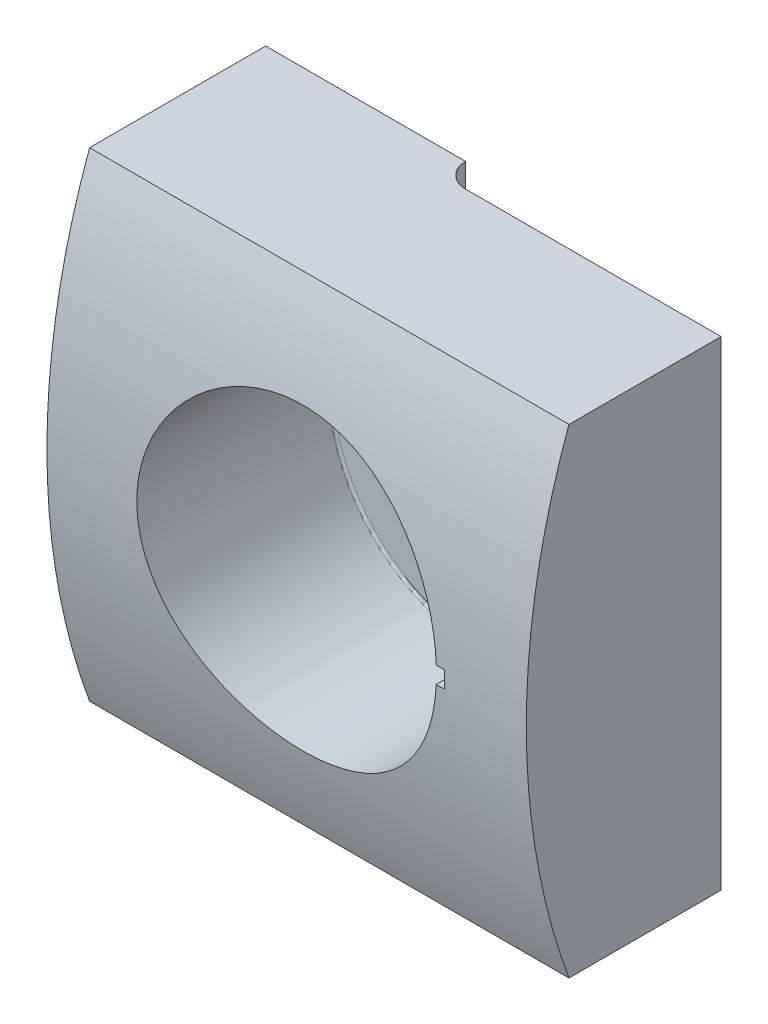
ISO-10303-21;
HEADER;
FILE_DESCRIPTION(('STEP AP214'),'2;1');
FILE_NAME('part.step','',(''),(''),'','','');
FILE_SCHEMA(('AUTOMOTIVE_DESIGN { 1 0 10303 214 1 1 1 1 }'));
ENDSEC;
DATA;
#1=APPLICATION_CONTEXT('core data for automotive mechanical design processes');
#2=APPLICATION_PROTOCOL_DEFINITION('international standard','automotive_design',2000,#1);
#3=PRODUCT_CONTEXT('',#1,'mechanical');
#4=PRODUCT('Part','Part','',(#3));
#5=PRODUCT_RELATED_PRODUCT_CATEGORY('part','',(#4));
#6=PRODUCT_DEFINITION_FORMATION('','',#4);
#7=PRODUCT_DEFINITION_CONTEXT('part definition',#1,'design');
#8=PRODUCT_DEFINITION('design','',#6,#7);
#9=PRODUCT_DEFINITION_SHAPE('','',#8);
#10=(LENGTH_UNIT() NAMED_UNIT(*) SI_UNIT(.MILLI.,.METRE.));
#11=(NAMED_UNIT(*) PLANE_ANGLE_UNIT() SI_UNIT($,.RADIAN.));
#12=(NAMED_UNIT(*) SI_UNIT($,.STERADIAN.) SOLID_ANGLE_UNIT());
#13=UNCERTAINTY_MEASURE_WITH_UNIT(LENGTH_MEASURE(1.E-05),#10,'distance_accuracy_value','');
#14=(GEOMETRIC_REPRESENTATION_CONTEXT(3) GLOBAL_UNCERTAINTY_ASSIGNED_CONTEXT((#13)) GLOBAL_UNIT_ASSIGNED_CONTEXT((#10,
#11,#12)) REPRESENTATION_CONTEXT('',''));
#15=CARTESIAN_POINT('',(0.,0.,0.));
#16=DIRECTION('',(0.,0.,1.));
#17=DIRECTION('',(1.,0.,0.));
#18=AXIS2_PLACEMENT_3D('',#15,#16,#17);
#19=CARTESIAN_POINT('',(0.,0.,20.6375));
#20=DIRECTION('',(1.,0.,0.));
#21=DIRECTION('',(0.,1.,0.));
#22=AXIS2_PLACEMENT_3D('',#19,#20,#21);
#23=PLANE('',#22);
#24=DIRECTION('',(0.,0.,-1.));
#25=VECTOR('',#24,1.);
#26=CARTESIAN_POINT('',(0.,0.,20.6375));
#27=LINE('',#26,#25);
#28=CARTESIAN_POINT('',(0.,0.,16.1196405511863));
#29=VERTEX_POINT('',#28);
#30=CARTESIAN_POINT('',(0.,0.,-2.54));
#31=VERTEX_POINT('',#30);
#32=EDGE_CURVE('E197',#29,#31,#27,.T.);
#33=ORIENTED_EDGE('',*,*,#32,.F.);
#34=CARTESIAN_POINT('',(0.,25.4,-53.0225));
#35=DIRECTION('',(-1.,0.,0.));
#36=DIRECTION('',(0.,-1.,0.));
#37=AXIS2_PLACEMENT_3D('',#34,#35,#36);
#38=CIRCLE('',#37,73.66);
#39=CARTESIAN_POINT('',(0.,50.8,16.1196405511863));
#40=VERTEX_POINT('',#39);
#41=EDGE_CURVE('E226',#29,#40,#38,.T.);
#42=ORIENTED_EDGE('',*,*,#41,.T.);
#43=DIRECTION('',(0.,0.,-1.));
#44=VECTOR('',#43,1.);
#45=CARTESIAN_POINT('',(0.,50.8,20.6375));
#46=LINE('',#45,#44);
#47=CARTESIAN_POINT('',(0.,50.8,-2.54));
#48=VERTEX_POINT('',#47);
#49=EDGE_CURVE('E245',#40,#48,#46,.T.);
#50=ORIENTED_EDGE('',*,*,#49,.T.);
#51=DIRECTION('',(0.,1.,0.));
#52=VECTOR('',#51,1.);
#53=CARTESIAN_POINT('',(0.,50.8,-2.54));
#54=LINE('',#53,#52);
#55=EDGE_CURVE('E198',#31,#48,#54,.T.);
#56=ORIENTED_EDGE('',*,*,#55,.F.);
#57=EDGE_LOOP('',(#33,#42,#50,#56));
#58=FACE_BOUND('',#57,.T.);
#59=ADVANCED_FACE('F52',(#58),#23,.F.);
#60=CARTESIAN_POINT('',(50.8,0.,20.6375));
#61=DIRECTION('',(-1.,0.,0.));
#62=DIRECTION('',(0.,-1.,0.));
#63=AXIS2_PLACEMENT_3D('',#60,#61,#62);
#64=PLANE('',#63);
#65=CARTESIAN_POINT('',(50.8,25.4,-53.0225));
#66=DIRECTION('',(-1.,0.,0.));
#67=DIRECTION('',(0.,-1.,0.));
#68=AXIS2_PLACEMENT_3D('',#65,#66,#67);
#69=CIRCLE('',#68,73.66);
#70=CARTESIAN_POINT('',(50.8,0.,16.1196405511863));
#71=VERTEX_POINT('',#70);
#72=CARTESIAN_POINT('',(50.8,50.8,16.1196405511863));
#73=VERTEX_POINT('',#72);
#74=EDGE_CURVE('E227',#71,#73,#69,.T.);
#75=ORIENTED_EDGE('',*,*,#74,.F.);
#76=DIRECTION('',(0.,0.,-1.));
#77=VECTOR('',#76,1.);
#78=CARTESIAN_POINT('',(50.8,0.,20.6375));
#79=LINE('',#78,#77);
#80=CARTESIAN_POINT('',(50.8,0.,0.));
#81=VERTEX_POINT('',#80);
#82=EDGE_CURVE('E249',#71,#81,#79,.T.);
#83=ORIENTED_EDGE('',*,*,#82,.T.);
#84=DIRECTION('',(0.,1.,0.));
#85=VECTOR('',#84,1.);
#86=CARTESIAN_POINT('',(50.8,0.,0.));
#87=LINE('',#86,#85);
#88=CARTESIAN_POINT('',(50.8,50.8,0.));
#89=VERTEX_POINT('',#88);
#90=EDGE_CURVE('E239',#81,#89,#87,.T.);
#91=ORIENTED_EDGE('',*,*,#90,.T.);
#92=DIRECTION('',(0.,0.,-1.));
#93=VECTOR('',#92,1.);
#94=CARTESIAN_POINT('',(50.8,50.8,20.6375));
#95=LINE('',#94,#93);
#96=EDGE_CURVE('E247',#73,#89,#95,.T.);
#97=ORIENTED_EDGE('',*,*,#96,.F.);
#98=EDGE_LOOP('',(#75,#83,#91,#97));
#99=FACE_BOUND('',#98,.T.);
#100=ADVANCED_FACE('F300',(#99),#64,.F.);
#101=CARTESIAN_POINT('',(25.4,25.4,20.6375));
#102=DIRECTION('',(0.,0.,-1.));
#103=DIRECTION('',(-1.,0.,0.));
#104=AXIS2_PLACEMENT_3D('',#101,#102,#103);
#105=CYLINDRICAL_SURFACE('',#104,15.875);
#106=DIRECTION('',(0.,0.,-1.));
#107=VECTOR('',#106,1.);
#108=CARTESIAN_POINT('',(23.4155663187167,9.64951911957643,20.6375));
#109=LINE('',#108,#107);
#110=CARTESIAN_POINT('',(23.4155663187167,9.64951911957643,-0.0199230591322225));
#111=VERTEX_POINT('',#110);
#112=CARTESIAN_POINT('',(23.4155663187167,9.64951911957643,0.254000000000001));
#113=VERTEX_POINT('',#112);
#114=EDGE_CURVE('E72',#111,#113,#109,.F.);
#115=ORIENTED_EDGE('',*,*,#114,.T.);
#116=CARTESIAN_POINT('',(25.4,25.4,0.254000000000001));
#117=DIRECTION('',(0.,0.,-1.));
#118=DIRECTION('',(-1.,0.,0.));
#119=AXIS2_PLACEMENT_3D('',#116,#117,#118);
#120=CIRCLE('',#119,15.875);
#121=CARTESIAN_POINT('',(23.4155663187167,41.1504808804236,0.254000000000001));
#122=VERTEX_POINT('',#121);
#123=EDGE_CURVE('E350',#113,#122,#120,.T.);
#124=ORIENTED_EDGE('',*,*,#123,.T.);
#125=DIRECTION('',(0.,0.,-1.));
#126=VECTOR('',#125,1.);
#127=CARTESIAN_POINT('',(23.4155663187167,41.1504808804236,20.6375));
#128=LINE('',#127,#126);
#129=CARTESIAN_POINT('',(23.4155663187167,41.1504808804236,-0.0199230591322286));
#130=VERTEX_POINT('',#129);
#131=EDGE_CURVE('E79',#122,#130,#128,.T.);
#132=ORIENTED_EDGE('',*,*,#131,.T.);
#133=CARTESIAN_POINT('',(21.193075707722,40.7074299932759,-2.54));
#134=CARTESIAN_POINT('',(21.1930674626318,40.7074240713044,-2.47009046434625));
#135=CARTESIAN_POINT('',(21.1959618102618,40.7082230855012,-2.40018556196087));
#136=CARTESIAN_POINT('',(21.2074918590524,40.7113868030198,-2.26089734019969));
#137=CARTESIAN_POINT('',(21.2161266460045,40.7137512570332,-2.19151393954988));
#138=CARTESIAN_POINT('',(21.2390503527431,40.7199953161262,-2.05389908907198));
#139=CARTESIAN_POINT('',(21.2533276921007,40.7238718177606,-1.98566557647354));
#140=CARTESIAN_POINT('',(21.2874006548194,40.7330512464238,-1.85070763216034));
#141=CARTESIAN_POINT('',(21.3071963384652,40.7383541890357,-1.78398321694026));
#142=CARTESIAN_POINT('',(21.3746392111695,40.7562459338513,-1.58677804179848));
#143=CARTESIAN_POINT('',(21.4303643534818,40.7708239128615,-1.45913378943448));
#144=CARTESIAN_POINT('',(21.5615622585605,40.8041089051485,-1.21509971575874));
#145=CARTESIAN_POINT('',(21.6370399807504,40.8228169552074,-1.09871273095635));
#146=CARTESIAN_POINT('',(21.8073167975769,40.8633776163679,-0.877809360923906));
#147=CARTESIAN_POINT('',(21.9024742946502,40.8852859537233,-0.773579141703814));
#148=CARTESIAN_POINT('',(22.1085507673568,40.9303926507858,-0.582377103565726));
#149=CARTESIAN_POINT('',(22.2194741693564,40.9535913716583,-0.495410147895215));
#150=CARTESIAN_POINT('',(22.4572912803913,41.0003571364934,-0.33891679702401));
#151=CARTESIAN_POINT('',(22.5845291569087,41.0239177474095,-0.269911141380715));
#152=CARTESIAN_POINT('',(22.849093232744,41.0692842531978,-0.154422870818528));
#153=CARTESIAN_POINT('',(22.9864130375139,41.091091242238,-0.107926119158844));
#154=CARTESIAN_POINT('',(23.2257513643832,41.1257198239352,-0.0490940095865786));
#155=CARTESIAN_POINT('',(23.3262188153242,41.139293106995,-0.0307252647356308));
#156=CARTESIAN_POINT('',(23.5287621364567,41.16466417611,-0.00617344393740915));
#157=CARTESIAN_POINT('',(23.6308365701024,41.1764634583804,1.99547059984798E-05));
#158=CARTESIAN_POINT('',(23.733075707722,41.187241317083,0.));
#159=B_SPLINE_CURVE_WITH_KNOTS('',3,(#133,#134,#135,#136,#137,#138,#139,#140,#141,#142,#143,
#144,#145,#146,#147,#148,#149,#150,#151,#152,#153,#154,#155,#156,#157,#158),.UNSPECIFIED.,.F.,
.F.,(4,2,2,2,2,2,2,2,2,2,2,2,4),(0.,0.209656141056867,0.419278900780397,0.628473659295834,
0.837670703240037,1.25566916014704,1.67377266781703,2.10029383313741,2.52693498407766,
2.9648335796102,3.40245679450964,3.71084064478667,4.01896292319588),.UNSPECIFIED.);
#160=CARTESIAN_POINT('',(23.733075707722,41.187241317083,0.));
#161=VERTEX_POINT('',#160);
#162=EDGE_CURVE('E314',#130,#161,#159,.T.);
#163=ORIENTED_EDGE('',*,*,#162,.T.);
#164=CARTESIAN_POINT('',(25.4,25.4,0.));
#165=DIRECTION('',(0.,0.,1.));
#166=DIRECTION('',(1.,0.,0.));
#167=AXIS2_PLACEMENT_3D('',#164,#165,#166);
#168=CIRCLE('',#167,15.875);
#169=CARTESIAN_POINT('',(41.254951994338,26.1975727284946,0.));
#170=VERTEX_POINT('',#169);
#171=EDGE_CURVE('E234',#170,#161,#168,.T.);
#172=ORIENTED_EDGE('',*,*,#171,.F.);
#173=DIRECTION('',(0.,0.,-1.));
#174=VECTOR('',#173,1.);
#175=CARTESIAN_POINT('',(41.254951994338,26.1975727284946,20.6375));
#176=LINE('',#175,#174);
#177=CARTESIAN_POINT('',(41.254951994338,26.1975727284946,20.6331819107851));
#178=VERTEX_POINT('',#177);
#179=EDGE_CURVE('E219',#178,#170,#176,.T.);
#180=ORIENTED_EDGE('',*,*,#179,.F.);
#181=CARTESIAN_POINT('',(41.275,25.4,20.6375));
#182=CARTESIAN_POINT('',(41.2749983649898,25.8401105750112,20.6374990455375));
#183=CARTESIAN_POINT('',(41.2566826187541,26.280268491249,20.6335456133713));
#184=CARTESIAN_POINT('',(41.1835497028809,27.1575712882286,20.6178365600965));
#185=CARTESIAN_POINT('',(41.1287162815396,27.594714739869,20.6060774651895));
#186=CARTESIAN_POINT('',(40.9828544507387,28.4634255024877,20.5750559556111));
#187=CARTESIAN_POINT('',(40.89176419071,28.894981976939,20.5557807202985));
#188=CARTESIAN_POINT('',(40.6741167318351,29.7486824128831,20.5102634910188));
#189=CARTESIAN_POINT('',(40.5475589035999,30.1708262071997,20.4840213734215));
#190=CARTESIAN_POINT('',(40.2601864255991,31.0021059101546,20.4253412009708));
#191=CARTESIAN_POINT('',(40.0994249309458,31.4112608833868,20.3929127681159));
#192=CARTESIAN_POINT('',(39.7447356690261,32.2144646338467,20.3227194360243));
#193=CARTESIAN_POINT('',(39.5508070360766,32.6085130164541,20.2849543975035));
#194=CARTESIAN_POINT('',(39.1312691499158,33.3787292473585,20.2051269735707));
#195=CARTESIAN_POINT('',(38.9056707907213,33.7549031849479,20.1630660672371));
#196=CARTESIAN_POINT('',(38.4243276331545,34.4870486447416,20.075770074599));
#197=CARTESIAN_POINT('',(38.1685826825938,34.8430200649446,20.0305349722708));
#198=CARTESIAN_POINT('',(37.6248744217148,35.5373180329361,19.9374534383229));
#199=CARTESIAN_POINT('',(37.3365075520597,35.8753248788179,19.8895791734686));
#200=CARTESIAN_POINT('',(36.7325234134406,36.5259412397846,19.7931385128913));
#201=CARTESIAN_POINT('',(36.4169058594813,36.8385504891879,19.7445721099342));
#202=CARTESIAN_POINT('',(35.760490549342,37.4363174078449,19.6480879983036));
#203=CARTESIAN_POINT('',(35.4196893394735,37.7214712994737,19.6001703796746));
#204=CARTESIAN_POINT('',(34.7152115228674,38.2623351769797,19.5063307884436));
#205=CARTESIAN_POINT('',(34.3515348364685,38.5180450603128,19.4604088227922));
#206=CARTESIAN_POINT('',(33.5997219731391,39.0008043223629,19.371385368329));
#207=CARTESIAN_POINT('',(33.2113655971378,39.2275175120724,19.3283193435678));
#208=CARTESIAN_POINT('',(32.416432055019,39.6473630181573,19.2468157802021));
#209=CARTESIAN_POINT('',(32.0098547215415,39.8404950260086,19.2083782841227));
#210=CARTESIAN_POINT('',(31.1813749120303,40.191677800705,19.1372809422433));
#211=CARTESIAN_POINT('',(30.7594739478733,40.3497320175511,19.104620528315));
#212=CARTESIAN_POINT('',(29.9033398066409,40.629522526657,19.0460624693456));
#213=CARTESIAN_POINT('',(29.4691068450404,40.7512594530556,19.0201647062225));
#214=CARTESIAN_POINT('',(28.5981304463238,40.9558563701341,18.9762619520347));
#215=CARTESIAN_POINT('',(28.1615242444164,41.0392763603179,18.9581435406259));
#216=CARTESIAN_POINT('',(27.2826025800847,41.1692350026563,18.9297846376357));
#217=CARTESIAN_POINT('',(26.8402871696894,41.2157739906738,18.9195440743134));
#218=CARTESIAN_POINT('',(25.953243279162,41.271578949439,18.9072532441601));
#219=CARTESIAN_POINT('',(25.5085150522794,41.2808487589736,18.905202133802));
#220=CARTESIAN_POINT('',(24.6198898097486,41.2620474537343,18.9093506947798));
#221=CARTESIAN_POINT('',(24.1759927859115,41.2339767087945,18.9155502843978));
#222=CARTESIAN_POINT('',(23.3001262286265,41.1415577538619,18.9358291863125));
#223=CARTESIAN_POINT('',(22.8680845976254,41.0778599615766,18.9497671912293));
#224=CARTESIAN_POINT('',(22.0110112041577,40.9151744127127,18.9850126618123));
#225=CARTESIAN_POINT('',(21.5859793466883,40.8161871348214,19.0063200275161));
#226=CARTESIAN_POINT('',(20.7458512013877,40.5836920501408,19.0556881083276));
#227=CARTESIAN_POINT('',(20.330755360511,40.4501826936123,19.0837491266113));
#228=CARTESIAN_POINT('',(19.5133353510942,40.1496587768489,19.1458219118745));
#229=CARTESIAN_POINT('',(19.1110113345064,39.9826438181555,19.1798337496223));
#230=CARTESIAN_POINT('',(18.3187460301888,39.6149103020689,19.2531343924907));
#231=CARTESIAN_POINT('',(17.9289252114931,39.4139400080475,19.2924621375299));
#232=CARTESIAN_POINT('',(17.167554156348,38.980659821546,19.3750821018939));
#233=CARTESIAN_POINT('',(16.7960039808918,38.748349824454,19.418374334452));
#234=CARTESIAN_POINT('',(16.0735785457449,38.2539903235395,19.5077254432859));
#235=CARTESIAN_POINT('',(15.7227041174916,37.9919396249873,19.5537844306714));
#236=CARTESIAN_POINT('',(15.0439109977738,37.4398688766301,19.6474079804911));
#237=CARTESIAN_POINT('',(14.7159925933334,37.1498484772217,19.6949725617393));
#238=CARTESIAN_POINT('',(14.0786606442235,36.5374251920531,19.7913132264755));
#239=CARTESIAN_POINT('',(13.7697744171831,36.2144738800993,19.8400939178296));
#240=CARTESIAN_POINT('',(13.1802432125464,35.5435995270462,19.9365147657325));
#241=CARTESIAN_POINT('',(12.8995988397672,35.1956759514235,19.984154897839));
#242=CARTESIAN_POINT('',(12.3683505887461,34.4769734012873,20.0769897586108));
#243=CARTESIAN_POINT('',(12.1177603806215,34.1061841415634,20.1221833693885));
#244=CARTESIAN_POINT('',(11.7659591583866,33.5350229518112,20.1871563076372));
#245=CARTESIAN_POINT('',(11.6527032075727,33.3421339468825,20.2083449391908));
#246=CARTESIAN_POINT('',(11.4343639942536,32.9516020688834,20.2496466489622));
#247=CARTESIAN_POINT('',(11.3292829412853,32.7539579293489,20.2697594359415));
#248=CARTESIAN_POINT('',(11.0261190479053,32.1534123922906,20.3283620691029));
#249=CARTESIAN_POINT('',(10.8407014399545,31.7438489740805,20.3650069012862));
#250=CARTESIAN_POINT('',(10.5051365525269,30.9100466065001,20.4323151982194));
#251=CARTESIAN_POINT('',(10.3549885178741,30.485807971572,20.4629787910343));
#252=CARTESIAN_POINT('',(10.157238917447,29.841205316014,20.5038057494525));
#253=CARTESIAN_POINT('',(10.0959366072464,29.6251277525607,20.5165457556392));
#254=CARTESIAN_POINT('',(9.98254503198505,29.1905325201479,20.5402271445816));
#255=CARTESIAN_POINT('',(9.93045350308816,28.9720154648458,20.5511689692495));
#256=CARTESIAN_POINT('',(9.78818251899694,28.3134717054164,20.5811689477415));
#257=CARTESIAN_POINT('',(9.71192965435696,27.8702013513697,20.5974176471942));
#258=CARTESIAN_POINT('',(9.61147310475979,27.0889579150256,20.6189005062971));
#259=CARTESIAN_POINT('',(9.57906190412433,26.7520474535736,20.6258646632218));
#260=CARTESIAN_POINT('',(9.53582470501976,26.0767673256891,20.6351647809046));
#261=CARTESIAN_POINT('',(9.52499874285315,25.7383976568035,20.6375007338789));
#262=CARTESIAN_POINT('',(9.52500163501018,24.9598894249888,20.6374990455375));
#263=CARTESIAN_POINT('',(9.54331738124582,24.519731508751,20.6335456133713));
#264=CARTESIAN_POINT('',(9.61645029711904,23.6424287117714,20.6178365600965));
#265=CARTESIAN_POINT('',(9.67128371846039,23.205285260131,20.6060774651895));
#266=CARTESIAN_POINT('',(9.81714554926129,22.3365744975124,20.5750559556111));
#267=CARTESIAN_POINT('',(9.90823580929,21.905018023061,20.5557807202985));
#268=CARTESIAN_POINT('',(10.1258832681648,21.0513175871169,20.5102634910188));
#269=CARTESIAN_POINT('',(10.2524410964001,20.6291737928003,20.4840213734215));
#270=CARTESIAN_POINT('',(10.5398135744009,19.7978940898454,20.4253412009708));
#271=CARTESIAN_POINT('',(10.7005750690542,19.3887391166132,20.3929127681159));
#272=CARTESIAN_POINT('',(11.0552643309739,18.5855353661533,20.3227194360243));
#273=CARTESIAN_POINT('',(11.2491929639234,18.1914869835459,20.2849543975035));
#274=CARTESIAN_POINT('',(11.6687308500842,17.4212707526415,20.2051269735707));
#275=CARTESIAN_POINT('',(11.8943292092787,17.0450968150521,20.1630660672371));
#276=CARTESIAN_POINT('',(12.3756723668454,16.3129513552584,20.075770074599));
#277=CARTESIAN_POINT('',(12.6314173174061,15.9569799350554,20.0305349722708));
#278=CARTESIAN_POINT('',(13.1751255782851,15.2626819670639,19.9374534383229));
#279=CARTESIAN_POINT('',(13.4634924479402,14.9246751211821,19.8895791734686));
#280=CARTESIAN_POINT('',(14.0674765865594,14.2740587602154,19.7931385128913));
#281=CARTESIAN_POINT('',(14.3830941405186,13.9614495108121,19.7445721099342));
#282=CARTESIAN_POINT('',(15.0395094506579,13.3636825921551,19.6480879983036));
#283=CARTESIAN_POINT('',(15.3803106605264,13.0785287005264,19.6001703796746));
#284=CARTESIAN_POINT('',(16.0847884771326,12.5376648230203,19.5063307884436));
#285=CARTESIAN_POINT('',(16.4484651635315,12.2819549396872,19.4604088227922));
#286=CARTESIAN_POINT('',(17.2002780268608,11.7991956776372,19.371385368329));
#287=CARTESIAN_POINT('',(17.5886344028622,11.5724824879276,19.3283193435678));
#288=CARTESIAN_POINT('',(18.3835679449809,11.1526369818427,19.246815780202));
#289=CARTESIAN_POINT('',(18.7901452784585,10.9595049739914,19.2083782841227));
#290=CARTESIAN_POINT('',(19.6186250879696,10.608322199295,19.1372809422433));
#291=CARTESIAN_POINT('',(20.0405260521266,10.4502679824489,19.104620528315));
#292=CARTESIAN_POINT('',(20.896660193359,10.170477473343,19.0460624693456));
#293=CARTESIAN_POINT('',(21.3308931549596,10.0487405469444,19.0201647062225));
#294=CARTESIAN_POINT('',(22.2018695536762,9.84414362986585,18.9762619520347));
#295=CARTESIAN_POINT('',(22.6384757555835,9.76072363968208,18.9581435406259));
#296=CARTESIAN_POINT('',(23.5173974199153,9.63076499734366,18.9297846376357));
#297=CARTESIAN_POINT('',(23.9597128303106,9.58422600932617,18.9195440743134));
#298=CARTESIAN_POINT('',(24.8467567208379,9.528421050561,18.9072532441601));
#299=CARTESIAN_POINT('',(25.2914849477205,9.51915124102636,18.905202133802));
#300=CARTESIAN_POINT('',(26.1801101902513,9.53795254626572,18.9093506947798));
#301=CARTESIAN_POINT('',(26.6240072140884,9.56602329120554,18.9155502843978));
#302=CARTESIAN_POINT('',(27.4998737713735,9.6584422461381,18.9358291863125));
#303=CARTESIAN_POINT('',(27.9319154023746,9.72214003842338,18.9497671912293));
#304=CARTESIAN_POINT('',(28.7889887958422,9.8848255872873,18.9850126618123));
#305=CARTESIAN_POINT('',(29.2140206533117,9.98381286517857,19.0063200275161));
#306=CARTESIAN_POINT('',(30.0541487986123,10.2163079498592,19.0556881083275));
#307=CARTESIAN_POINT('',(30.469244639489,10.3498173063877,19.0837491266113));
#308=CARTESIAN_POINT('',(31.2866646489058,10.6503412231511,19.1458219118745));
#309=CARTESIAN_POINT('',(31.6889886654936,10.8173561818445,19.1798337496223));
#310=CARTESIAN_POINT('',(32.4812539698111,11.1850896979311,19.2531343924907));
#311=CARTESIAN_POINT('',(32.8710747885069,11.3860599919525,19.2924621375299));
#312=CARTESIAN_POINT('',(33.632445843652,11.819340178454,19.3750821018939));
#313=CARTESIAN_POINT('',(34.0039960191082,12.051650175546,19.418374334452));
#314=CARTESIAN_POINT('',(34.7264214542551,12.5460096764605,19.5077254432858));
#315=CARTESIAN_POINT('',(35.0772958825083,12.8080603750127,19.5537844306714));
#316=CARTESIAN_POINT('',(35.7560890022261,13.3601311233699,19.6474079804911));
#317=CARTESIAN_POINT('',(36.0840074066666,13.6501515227782,19.6949725617393));
#318=CARTESIAN_POINT('',(36.7213393557764,14.2625748079469,19.7913132264755));
#319=CARTESIAN_POINT('',(37.0302255828168,14.5855261199007,19.8400939178296));
#320=CARTESIAN_POINT('',(37.6197567874536,15.2564004729537,19.9365147657325));
#321=CARTESIAN_POINT('',(37.9004011602328,15.6043240485765,19.984154897839));
#322=CARTESIAN_POINT('',(38.4316494112538,16.3230265987127,20.0769897586108));
#323=CARTESIAN_POINT('',(38.6822396193784,16.6938158584366,20.1221833693885));
#324=CARTESIAN_POINT('',(39.0340408416133,17.2649770481888,20.1871563076372));
#325=CARTESIAN_POINT('',(39.1472967924272,17.4578660531175,20.2083449391908));
#326=CARTESIAN_POINT('',(39.3656360057463,17.8483979311166,20.2496466489622));
#327=CARTESIAN_POINT('',(39.4707170587147,18.0460420706511,20.2697594359415));
#328=CARTESIAN_POINT('',(39.7738809520946,18.6465876077094,20.3283620691029));
#329=CARTESIAN_POINT('',(39.9592985600455,19.0561510259195,20.3650069012862));
#330=CARTESIAN_POINT('',(40.2948634474731,19.8899533934999,20.4323151982194));
#331=CARTESIAN_POINT('',(40.4450114821259,20.314192028428,20.4629787910343));
#332=CARTESIAN_POINT('',(40.642761082553,20.958794683986,20.5038057494525));
#333=CARTESIAN_POINT('',(40.7040633927535,21.1748722474393,20.5165457556392));
#334=CARTESIAN_POINT('',(40.8174549680149,21.6094674798521,20.5402271445816));
#335=CARTESIAN_POINT('',(40.8695464969118,21.8279845351542,20.5511689692495));
#336=CARTESIAN_POINT('',(41.011817481003,22.4865282945836,20.5811689477415));
#337=CARTESIAN_POINT('',(41.088070345643,22.9297986486303,20.5974176471942));
#338=CARTESIAN_POINT('',(41.1885268952402,23.7110420849744,20.6189005062971));
#339=CARTESIAN_POINT('',(41.2209380958756,24.0479525464264,20.6258646632218));
#340=CARTESIAN_POINT('',(41.2641752949802,24.7232326743109,20.6351647809046));
#341=CARTESIAN_POINT('',(41.2750012571468,25.0616023431965,20.6375007338789));
#342=CARTESIAN_POINT('',(41.275,25.4,20.6375));
#343=B_SPLINE_CURVE_WITH_KNOTS('',3,(#181,#182,#183,#184,#185,#186,#187,#188,#189,#190,#191,
#192,#193,#194,#195,#196,#197,#198,#199,#200,#201,#202,#203,#204,#205,#206,#207,#208,#209,#210,
#211,#212,#213,#214,#215,#216,#217,#218,#219,#220,#221,#222,#223,#224,#225,#226,#227,#228,#229,
#230,#231,#232,#233,#234,#235,#236,#237,#238,#239,#240,#241,#242,#243,#244,#245,#246,#247,#248,
#249,#250,#251,#252,#253,#254,#255,#256,#257,#258,#259,#260,#261,#262,#263,#264,#265,#266,#267,
#268,#269,#270,#271,#272,#273,#274,#275,#276,#277,#278,#279,#280,#281,#282,#283,#284,#285,#286,
#287,#288,#289,#290,#291,#292,#293,#294,#295,#296,#297,#298,#299,#300,#301,#302,#303,#304,#305,
#306,#307,#308,#309,#310,#311,#312,#313,#314,#315,#316,#317,#318,#319,#320,#321,#322,#323,#324,
#325,#326,#327,#328,#329,#330,#331,#332,#333,#334,#335,#336,#337,#338,#339,#340,#341,#342),
.UNSPECIFIED.,.T.,.F.,(4,2,2,2,2,2,2,2,2,2,2,2,2,2,2,2,2,2,2,2,2,2,2,2,2,2,2,2,2,2,2,2,2,2,2,2,
2,2,2,2,2,2,2,2,2,2,2,2,2,2,2,2,2,2,2,2,2,2,2,2,2,2,2,2,2,2,2,2,2,2,2,2,2,2,2,2,2,2,2,2,4),(0.,
1.3200162300122,2.64062030854114,3.96348692866709,5.28637702518688,6.60722607328312,
7.92810960163457,9.24853986978026,10.5689768041154,11.9080385062938,13.247114214449,
14.5863739055838,15.9256382607957,17.2792423721957,18.6328589190495,19.9863422747906,
21.3398019958839,22.6727969810606,24.0057798269617,25.3386253699088,26.6714577119758,
27.9807163623864,29.2899572539172,30.5992569291126,31.9085721758121,33.2280583963416,
34.5475490214224,35.8670926712502,37.1866528166697,38.5336822187952,39.8807404622682,
41.2284091090985,41.9022819398481,42.5763362787824,43.927801191267,45.2792371641648,
45.9539501718903,46.6284971166937,47.9768043215526,48.9917530032923,50.0067033919925,
51.3267196220047,52.6473237005337,53.9701903206596,55.2930804171794,56.6139294652757,
57.9348129936271,59.2552432617728,60.5756801961079,61.9147418982863,63.2538176064415,
64.5930772975763,65.9323416527882,67.2859457641882,68.639562311042,69.9930456667831,
71.3465053878765,72.6795003730531,74.0124832189542,75.3453287619014,76.6781611039683,
77.9874197543789,79.2966606459097,80.6059603211051,81.9152755678046,83.2347617883342,
84.554252413415,85.8737960632428,87.1933562086622,88.5403856107878,89.8874438542607,
91.2351125010911,91.9089853318407,92.5830396707749,93.9345045832596,95.2859405561574,
95.9606535638828,96.6352005086863,97.9835077135452,98.9984563952848,100.013406783985),.UNSPECIFIED.);
#344=CARTESIAN_POINT('',(41.2446958748121,24.4195727284946,20.6309748831668));
#345=VERTEX_POINT('',#344);
#346=EDGE_CURVE('E253',#178,#345,#343,.T.);
#347=ORIENTED_EDGE('',*,*,#346,.T.);
#348=DIRECTION('',(0.,0.,-1.));
#349=VECTOR('',#348,1.);
#350=CARTESIAN_POINT('',(41.2446958748121,24.4195727284946,20.6375));
#351=LINE('',#350,#349);
#352=CARTESIAN_POINT('',(41.2446958748121,24.4195727284946,0.));
#353=VERTEX_POINT('',#352);
#354=EDGE_CURVE('E222',#353,#345,#351,.F.);
#355=ORIENTED_EDGE('',*,*,#354,.F.);
#356=CARTESIAN_POINT('',(23.733075707722,9.61275868291697,0.));
#357=VERTEX_POINT('',#356);
#358=EDGE_CURVE('E233',#357,#353,#168,.T.);
#359=ORIENTED_EDGE('',*,*,#358,.F.);
#360=CARTESIAN_POINT('',(23.733075707722,9.61275868291697,0.));
#361=CARTESIAN_POINT('',(23.6610673159276,9.62035700087935,7.05324366075257E-06));
#362=CARTESIAN_POINT('',(23.5891180644539,9.62845675340505,-0.00306201290901656));
#363=CARTESIAN_POINT('',(23.4458564696311,9.64556850744455,-0.0152696356487413));
#364=CARTESIAN_POINT('',(23.3745440292212,9.65458036726306,-0.0244072507134436));
#365=CARTESIAN_POINT('',(23.2331501508199,9.67341505800245,-0.0486524466637669));
#366=CARTESIAN_POINT('',(23.1630671426808,9.68323674682142,-0.0637517299992026));
#367=CARTESIAN_POINT('',(23.0245371062902,9.70357644514621,-0.0997742139983803));
#368=CARTESIAN_POINT('',(22.9560901059255,9.71409446650998,-0.120697513859543));
#369=CARTESIAN_POINT('',(22.7539117873736,9.74648963835049,-0.191976655502372));
#370=CARTESIAN_POINT('',(22.6232117770793,9.76922564549354,-0.250864483498954));
#371=CARTESIAN_POINT('',(22.3737202023378,9.81560333714363,-0.389613539123116));
#372=CARTESIAN_POINT('',(22.2549302664692,9.83924514490022,-0.469477629646183));
#373=CARTESIAN_POINT('',(22.030974115064,9.8861822879653,-0.649154999233131));
#374=CARTESIAN_POINT('',(21.9259898535435,9.90946998542524,-0.749197659253314));
#375=CARTESIAN_POINT('',(21.7343214311284,9.95370171765881,-0.965987204817113));
#376=CARTESIAN_POINT('',(21.6476397533018,9.97464543424925,-1.08273635329012));
#377=CARTESIAN_POINT('',(21.4956264816776,10.0124201387529,-1.32910617758471));
#378=CARTESIAN_POINT('',(21.4301815943402,10.0292728257219,-1.45865357521752));
#379=CARTESIAN_POINT('',(21.3222022159141,10.0575643022396,-1.72746283643044));
#380=CARTESIAN_POINT('',(21.2796451872935,10.0690084162247,-1.86671499056599));
#381=CARTESIAN_POINT('',(21.2306117287146,10.0822915180029,-2.09587090389852));
#382=CARTESIAN_POINT('',(21.2165508044851,10.0861325296412,-2.18410711284178));
#383=CARTESIAN_POINT('',(21.1977817290294,10.0912764422094,-2.36154658441771));
#384=CARTESIAN_POINT('',(21.1930637253518,10.0925820168223,-2.45074872848508));
#385=CARTESIAN_POINT('',(21.193075707722,10.0925700067241,-2.54));
#386=B_SPLINE_CURVE_WITH_KNOTS('',3,(#360,#361,#362,#363,#364,#365,#366,#367,#368,#369,#370,
#371,#372,#373,#374,#375,#376,#377,#378,#379,#380,#381,#382,#383,#384,#385),.UNSPECIFIED.,.F.,
.F.,(4,2,2,2,2,2,2,2,2,2,2,2,4),(0.,0.217147596115361,0.434261510114929,0.651074300553652,
0.867890784076976,1.30112528106664,1.73441893779352,2.17294796105432,2.6115364403292,
3.04774513807699,3.48352351372667,3.75133141902526,4.01885676038242),.UNSPECIFIED.);
#387=EDGE_CURVE('E179',#357,#111,#386,.T.);
#388=ORIENTED_EDGE('',*,*,#387,.T.);
#389=EDGE_LOOP('',(#115,#124,#132,#163,#172,#180,#347,#355,#359,#388));
#390=FACE_BOUND('',#389,.T.);
#391=ADVANCED_FACE('F263',(#390),#105,.F.);
#392=CARTESIAN_POINT('',(0.,0.,20.6375));
#393=DIRECTION('',(0.,1.,0.));
#394=DIRECTION('',(0.,0.,1.));
#395=AXIS2_PLACEMENT_3D('',#392,#393,#394);
#396=PLANE('',#395);
#397=DIRECTION('',(-1.,0.,0.));
#398=VECTOR('',#397,1.);
#399=CARTESIAN_POINT('',(50.8,0.,16.1196405511863));
#400=LINE('',#399,#398);
#401=EDGE_CURVE('E224',#71,#29,#400,.T.);
#402=ORIENTED_EDGE('',*,*,#401,.T.);
#403=ORIENTED_EDGE('',*,*,#32,.T.);
#404=DIRECTION('',(-1.,0.,0.));
#405=VECTOR('',#404,1.);
#406=CARTESIAN_POINT('',(21.193075707722,0.,-2.54));
#407=LINE('',#406,#405);
#408=CARTESIAN_POINT('',(21.193075707722,0.,-2.54));
#409=VERTEX_POINT('',#408);
#410=EDGE_CURVE('E187',#409,#31,#407,.T.);
#411=ORIENTED_EDGE('',*,*,#410,.F.);
#412=CARTESIAN_POINT('',(23.733075707722,0.,-2.54));
#413=DIRECTION('',(0.,1.,0.));
#414=DIRECTION('',(0.,0.,1.));
#415=AXIS2_PLACEMENT_3D('',#412,#413,#414);
#416=CIRCLE('',#415,2.54);
#417=CARTESIAN_POINT('',(23.733075707722,0.,0.));
#418=VERTEX_POINT('',#417);
#419=EDGE_CURVE('E169',#409,#418,#416,.T.);
#420=ORIENTED_EDGE('',*,*,#419,.T.);
#421=DIRECTION('',(1.,0.,0.));
#422=VECTOR('',#421,1.);
#423=CARTESIAN_POINT('',(0.,0.,0.));
#424=LINE('',#423,#422);
#425=EDGE_CURVE('E237',#418,#81,#424,.T.);
#426=ORIENTED_EDGE('',*,*,#425,.T.);
#427=ORIENTED_EDGE('',*,*,#82,.F.);
#428=EDGE_LOOP('',(#402,#403,#411,#420,#426,#427));
#429=FACE_BOUND('',#428,.T.);
#430=ADVANCED_FACE('F195',(#429),#396,.F.);
#431=CARTESIAN_POINT('',(0.,50.8,20.6375));
#432=DIRECTION('',(0.,-1.,0.));
#433=DIRECTION('',(0.,0.,-1.));
#434=AXIS2_PLACEMENT_3D('',#431,#432,#433);
#435=PLANE('',#434);
#436=DIRECTION('',(-1.,0.,0.));
#437=VECTOR('',#436,1.);
#438=CARTESIAN_POINT('',(50.8,50.8,16.1196405511863));
#439=LINE('',#438,#437);
#440=EDGE_CURVE('E229',#73,#40,#439,.T.);
#441=ORIENTED_EDGE('',*,*,#440,.F.);
#442=ORIENTED_EDGE('',*,*,#96,.T.);
#443=DIRECTION('',(-1.,0.,0.));
#444=VECTOR('',#443,1.);
#445=CARTESIAN_POINT('',(0.,50.8,0.));
#446=LINE('',#445,#444);
#447=CARTESIAN_POINT('',(23.733075707722,50.8,0.));
#448=VERTEX_POINT('',#447);
#449=EDGE_CURVE('E242',#89,#448,#446,.T.);
#450=ORIENTED_EDGE('',*,*,#449,.T.);
#451=CARTESIAN_POINT('',(23.733075707722,50.8,-2.54));
#452=DIRECTION('',(0.,-1.,0.));
#453=DIRECTION('',(0.,0.,-1.));
#454=AXIS2_PLACEMENT_3D('',#451,#452,#453);
#455=CIRCLE('',#454,2.54);
#456=CARTESIAN_POINT('',(21.193075707722,50.8,-2.54));
#457=VERTEX_POINT('',#456);
#458=EDGE_CURVE('E180',#448,#457,#455,.T.);
#459=ORIENTED_EDGE('',*,*,#458,.T.);
#460=DIRECTION('',(1.,0.,0.));
#461=VECTOR('',#460,1.);
#462=CARTESIAN_POINT('',(21.193075707722,50.8,-2.54));
#463=LINE('',#462,#461);
#464=EDGE_CURVE('E200',#48,#457,#463,.T.);
#465=ORIENTED_EDGE('',*,*,#464,.F.);
#466=ORIENTED_EDGE('',*,*,#49,.F.);
#467=EDGE_LOOP('',(#441,#442,#450,#459,#465,#466));
#468=FACE_BOUND('',#467,.T.);
#469=ADVANCED_FACE('F404',(#468),#435,.F.);
#470=CARTESIAN_POINT('',(0.,0.,0.));
#471=DIRECTION('',(0.,0.,-1.));
#472=DIRECTION('',(-1.,0.,0.));
#473=AXIS2_PLACEMENT_3D('',#470,#471,#472);
#474=PLANE('',#473);
#475=ORIENTED_EDGE('',*,*,#171,.T.);
#476=DIRECTION('',(0.,-1.,0.));
#477=VECTOR('',#476,1.);
#478=CARTESIAN_POINT('',(23.733075707722,0.,0.));
#479=LINE('',#478,#477);
#480=EDGE_CURVE('E321',#161,#448,#479,.F.);
#481=ORIENTED_EDGE('',*,*,#480,.T.);
#482=ORIENTED_EDGE('',*,*,#449,.F.);
#483=ORIENTED_EDGE('',*,*,#90,.F.);
#484=ORIENTED_EDGE('',*,*,#425,.F.);
#485=DIRECTION('',(0.,-1.,0.));
#486=VECTOR('',#485,1.);
#487=CARTESIAN_POINT('',(23.733075707722,0.,0.));
#488=LINE('',#487,#486);
#489=EDGE_CURVE('E175',#418,#357,#488,.F.);
#490=ORIENTED_EDGE('',*,*,#489,.T.);
#491=ORIENTED_EDGE('',*,*,#358,.T.);
#492=DIRECTION('',(-1.,0.,0.));
#493=VECTOR('',#492,1.);
#494=CARTESIAN_POINT('',(38.292640525075,24.4195727284946,0.));
#495=LINE('',#494,#493);
#496=CARTESIAN_POINT('',(42.1073939087508,24.4195727284946,0.));
#497=VERTEX_POINT('',#496);
#498=EDGE_CURVE('E213',#497,#353,#495,.T.);
#499=ORIENTED_EDGE('',*,*,#498,.F.);
#500=DIRECTION('',(0.,-1.,0.));
#501=VECTOR('',#500,1.);
#502=CARTESIAN_POINT('',(42.1073939087508,26.1975727284946,0.));
#503=LINE('',#502,#501);
#504=CARTESIAN_POINT('',(42.1073939087508,26.1975727284946,0.));
#505=VERTEX_POINT('',#504);
#506=EDGE_CURVE('E210',#505,#497,#503,.T.);
#507=ORIENTED_EDGE('',*,*,#506,.F.);
#508=DIRECTION('',(1.,0.,0.));
#509=VECTOR('',#508,1.);
#510=CARTESIAN_POINT('',(38.292640525075,26.1975727284946,0.));
#511=LINE('',#510,#509);
#512=EDGE_CURVE('E205',#170,#505,#511,.T.);
#513=ORIENTED_EDGE('',*,*,#512,.F.);
#514=EDGE_LOOP('',(#475,#481,#482,#483,#484,#490,#491,#499,#507,#513));
#515=FACE_BOUND('',#514,.T.);
#516=ADVANCED_FACE('F271',(#515),#474,.T.);
#517=CARTESIAN_POINT('',(50.8,25.4,-53.0225));
#518=DIRECTION('',(-1.,0.,0.));
#519=DIRECTION('',(0.,-1.,0.));
#520=AXIS2_PLACEMENT_3D('',#517,#518,#519);
#521=CYLINDRICAL_SURFACE('',#520,73.66);
#522=DIRECTION('',(-1.,0.,0.));
#523=VECTOR('',#522,1.);
#524=CARTESIAN_POINT('',(50.8,24.4195727284946,20.6309748831668));
#525=LINE('',#524,#523);
#526=CARTESIAN_POINT('',(42.1073939087508,24.4195727284946,20.6309748831668));
#527=VERTEX_POINT('',#526);
#528=EDGE_CURVE('E386',#345,#527,#525,.F.);
#529=ORIENTED_EDGE('',*,*,#528,.F.);
#530=ORIENTED_EDGE('',*,*,#346,.F.);
#531=DIRECTION('',(-1.,0.,0.));
#532=VECTOR('',#531,1.);
#533=CARTESIAN_POINT('',(50.8,26.1975727284946,20.6331819107851));
#534=LINE('',#533,#532);
#535=CARTESIAN_POINT('',(42.1073939087508,26.1975727284946,20.6331819107851));
#536=VERTEX_POINT('',#535);
#537=EDGE_CURVE('E380',#536,#178,#534,.T.);
#538=ORIENTED_EDGE('',*,*,#537,.F.);
#539=CARTESIAN_POINT('',(42.1073939087508,25.4,-53.0225));
#540=DIRECTION('',(1.,0.,0.));
#541=DIRECTION('',(0.,0.,-1.));
#542=AXIS2_PLACEMENT_3D('',#539,#540,#541);
#543=CIRCLE('',#542,73.66);
#544=EDGE_CURVE('E261',#527,#536,#543,.F.);
#545=ORIENTED_EDGE('',*,*,#544,.F.);
#546=EDGE_LOOP('',(#529,#530,#538,#545));
#547=FACE_BOUND('',#546,.T.);
#548=ORIENTED_EDGE('',*,*,#41,.F.);
#549=ORIENTED_EDGE('',*,*,#401,.F.);
#550=ORIENTED_EDGE('',*,*,#74,.T.);
#551=ORIENTED_EDGE('',*,*,#440,.T.);
#552=EDGE_LOOP('',(#548,#549,#550,#551));
#553=FACE_BOUND('',#552,.T.);
#554=ADVANCED_FACE('F266',(#547,#553),#521,.T.);
#555=CARTESIAN_POINT('',(38.292640525075,24.4195727284946,20.6375));
#556=DIRECTION('',(0.,-1.,0.));
#557=DIRECTION('',(0.,0.,-1.));
#558=AXIS2_PLACEMENT_3D('',#555,#556,#557);
#559=PLANE('',#558);
#560=ORIENTED_EDGE('',*,*,#354,.T.);
#561=ORIENTED_EDGE('',*,*,#528,.T.);
#562=DIRECTION('',(0.,0.,-1.));
#563=VECTOR('',#562,1.);
#564=CARTESIAN_POINT('',(42.1073939087508,24.4195727284946,20.6375));
#565=LINE('',#564,#563);
#566=EDGE_CURVE('E217',#527,#497,#565,.T.);
#567=ORIENTED_EDGE('',*,*,#566,.T.);
#568=ORIENTED_EDGE('',*,*,#498,.T.);
#569=EDGE_LOOP('',(#560,#561,#567,#568));
#570=FACE_BOUND('',#569,.T.);
#571=ADVANCED_FACE('F270',(#570),#559,.F.);
#572=CARTESIAN_POINT('',(42.1073939087508,26.1975727284946,20.6375));
#573=DIRECTION('',(1.,0.,0.));
#574=DIRECTION('',(0.,0.,-1.));
#575=AXIS2_PLACEMENT_3D('',#572,#573,#574);
#576=PLANE('',#575);
#577=ORIENTED_EDGE('',*,*,#566,.F.);
#578=ORIENTED_EDGE('',*,*,#544,.T.);
#579=DIRECTION('',(0.,0.,-1.));
#580=VECTOR('',#579,1.);
#581=CARTESIAN_POINT('',(42.1073939087508,26.1975727284946,20.6375));
#582=LINE('',#581,#580);
#583=EDGE_CURVE('E216',#536,#505,#582,.T.);
#584=ORIENTED_EDGE('',*,*,#583,.T.);
#585=ORIENTED_EDGE('',*,*,#506,.T.);
#586=EDGE_LOOP('',(#577,#578,#584,#585));
#587=FACE_BOUND('',#586,.T.);
#588=ADVANCED_FACE('F277',(#587),#576,.F.);
#589=CARTESIAN_POINT('',(38.292640525075,26.1975727284946,20.6375));
#590=DIRECTION('',(0.,1.,0.));
#591=DIRECTION('',(0.,0.,1.));
#592=AXIS2_PLACEMENT_3D('',#589,#590,#591);
#593=PLANE('',#592);
#594=ORIENTED_EDGE('',*,*,#179,.T.);
#595=ORIENTED_EDGE('',*,*,#512,.T.);
#596=ORIENTED_EDGE('',*,*,#583,.F.);
#597=ORIENTED_EDGE('',*,*,#537,.T.);
#598=EDGE_LOOP('',(#594,#595,#596,#597));
#599=FACE_BOUND('',#598,.T.);
#600=ADVANCED_FACE('F273',(#599),#593,.F.);
#601=CARTESIAN_POINT('',(0.,0.,0.));
#602=DIRECTION('',(0.,0.,-1.));
#603=DIRECTION('',(-1.,0.,0.));
#604=AXIS2_PLACEMENT_3D('',#601,#602,#603);
#605=PLANE('',#604);
#606=CARTESIAN_POINT('',(23.733075707722,38.6304039395558,0.));
#607=DIRECTION('',(0.,0.,-1.));
#608=DIRECTION('',(-1.,0.,0.));
#609=AXIS2_PLACEMENT_3D('',#606,#607,#608);
#610=CIRCLE('',#609,2.54);
#611=CARTESIAN_POINT('',(21.193075707722,38.6304039395558,0.));
#612=VERTEX_POINT('',#611);
#613=CARTESIAN_POINT('',(22.2650288178043,40.7031891018442,0.));
#614=VERTEX_POINT('',#613);
#615=EDGE_CURVE('E341',#612,#614,#610,.T.);
#616=ORIENTED_EDGE('',*,*,#615,.T.);
#617=CARTESIAN_POINT('',(25.4,25.4,0.));
#618=DIRECTION('',(0.,0.,-1.));
#619=DIRECTION('',(-1.,0.,0.));
#620=AXIS2_PLACEMENT_3D('',#617,#618,#619);
#621=CIRCLE('',#620,15.621);
#622=CARTESIAN_POINT('',(22.2650288178043,10.0968108981558,0.));
#623=VERTEX_POINT('',#622);
#624=EDGE_CURVE('E347',#614,#623,#621,.F.);
#625=ORIENTED_EDGE('',*,*,#624,.T.);
#626=CARTESIAN_POINT('',(23.733075707722,12.1695960604442,0.));
#627=DIRECTION('',(0.,0.,-1.));
#628=DIRECTION('',(-1.,0.,0.));
#629=AXIS2_PLACEMENT_3D('',#626,#627,#628);
#630=CIRCLE('',#629,2.54);
#631=CARTESIAN_POINT('',(21.193075707722,12.1695960604442,0.));
#632=VERTEX_POINT('',#631);
#633=EDGE_CURVE('E339',#623,#632,#630,.T.);
#634=ORIENTED_EDGE('',*,*,#633,.T.);
#635=DIRECTION('',(0.,-1.,0.));
#636=VECTOR('',#635,1.);
#637=CARTESIAN_POINT('',(21.193075707722,50.8,0.));
#638=LINE('',#637,#636);
#639=EDGE_CURVE('E191',#612,#632,#638,.T.);
#640=ORIENTED_EDGE('',*,*,#639,.F.);
#641=EDGE_LOOP('',(#616,#625,#634,#640));
#642=FACE_BOUND('',#641,.T.);
#643=ADVANCED_FACE('F276',(#642),#605,.F.);
#644=CARTESIAN_POINT('',(21.193075707722,50.8,-2.54));
#645=DIRECTION('',(-1.,0.,0.));
#646=DIRECTION('',(0.,-1.,0.));
#647=AXIS2_PLACEMENT_3D('',#644,#645,#646);
#648=PLANE('',#647);
#649=ORIENTED_EDGE('',*,*,#639,.T.);
#650=DIRECTION('',(0.,0.,-1.));
#651=VECTOR('',#650,1.);
#652=CARTESIAN_POINT('',(21.193075707722,12.1695960604442,-2.54));
#653=LINE('',#652,#651);
#654=CARTESIAN_POINT('',(21.193075707722,12.1695960604442,-2.54));
#655=VERTEX_POINT('',#654);
#656=EDGE_CURVE('E332',#632,#655,#653,.T.);
#657=ORIENTED_EDGE('',*,*,#656,.T.);
#658=DIRECTION('',(0.,-1.,0.));
#659=VECTOR('',#658,1.);
#660=CARTESIAN_POINT('',(21.193075707722,50.8,-2.54));
#661=LINE('',#660,#659);
#662=CARTESIAN_POINT('',(21.193075707722,38.6304039395558,-2.54));
#663=VERTEX_POINT('',#662);
#664=EDGE_CURVE('E190',#663,#655,#661,.T.);
#665=ORIENTED_EDGE('',*,*,#664,.F.);
#666=DIRECTION('',(0.,0.,-1.));
#667=VECTOR('',#666,1.);
#668=CARTESIAN_POINT('',(21.193075707722,38.6304039395558,-2.54));
#669=LINE('',#668,#667);
#670=EDGE_CURVE('E329',#663,#612,#669,.F.);
#671=ORIENTED_EDGE('',*,*,#670,.T.);
#672=EDGE_LOOP('',(#649,#657,#665,#671));
#673=FACE_BOUND('',#672,.T.);
#674=ADVANCED_FACE('F285',(#673),#648,.F.);
#675=CARTESIAN_POINT('',(0.,0.,-2.54));
#676=DIRECTION('',(0.,0.,-1.));
#677=DIRECTION('',(-1.,0.,0.));
#678=AXIS2_PLACEMENT_3D('',#675,#676,#677);
#679=PLANE('',#678);
#680=EDGE_CURVE('E193',#457,#663,#661,.T.);
#681=ORIENTED_EDGE('',*,*,#680,.T.);
#682=ORIENTED_EDGE('',*,*,#664,.T.);
#683=EDGE_CURVE('E173',#655,#409,#661,.T.);
#684=ORIENTED_EDGE('',*,*,#683,.T.);
#685=ORIENTED_EDGE('',*,*,#410,.T.);
#686=ORIENTED_EDGE('',*,*,#55,.T.);
#687=ORIENTED_EDGE('',*,*,#464,.T.);
#688=EDGE_LOOP('',(#681,#682,#684,#685,#686,#687));
#689=FACE_BOUND('',#688,.T.);
#690=ADVANCED_FACE('F185',(#689),#679,.T.);
#691=CARTESIAN_POINT('',(23.733075707722,50.8,-2.54));
#692=DIRECTION('',(0.,-1.,0.));
#693=DIRECTION('',(1.,0.,0.));
#694=AXIS2_PLACEMENT_3D('',#691,#692,#693);
#695=CYLINDRICAL_SURFACE('',#694,2.54);
#696=ORIENTED_EDGE('',*,*,#458,.F.);
#697=ORIENTED_EDGE('',*,*,#480,.F.);
#698=ORIENTED_EDGE('',*,*,#162,.F.);
#699=CARTESIAN_POINT('',(23.733075707722,38.6304039395558,-2.54));
#700=DIRECTION('',(0.,-0.707106781186547,0.707106781186547));
#701=DIRECTION('',(0.,-0.707106781186547,-0.707106781186547));
#702=AXIS2_PLACEMENT_3D('',#699,#700,#701);
#703=ELLIPSE('',#702,3.59210244842766,2.54);
#704=EDGE_CURVE('E344',#130,#663,#703,.T.);
#705=ORIENTED_EDGE('',*,*,#704,.T.);
#706=ORIENTED_EDGE('',*,*,#680,.F.);
#707=EDGE_LOOP('',(#696,#697,#698,#705,#706));
#708=FACE_BOUND('',#707,.T.);
#709=ADVANCED_FACE('F293',(#708),#695,.F.);
#710=CARTESIAN_POINT('',(23.733075707722,50.8,-2.54));
#711=DIRECTION('',(0.,-1.,0.));
#712=DIRECTION('',(1.,0.,0.));
#713=AXIS2_PLACEMENT_3D('',#710,#711,#712);
#714=CYLINDRICAL_SURFACE('',#713,2.54);
#715=ORIENTED_EDGE('',*,*,#387,.F.);
#716=ORIENTED_EDGE('',*,*,#489,.F.);
#717=ORIENTED_EDGE('',*,*,#419,.F.);
#718=ORIENTED_EDGE('',*,*,#683,.F.);
#719=CARTESIAN_POINT('',(23.733075707722,12.1695960604442,-2.54));
#720=DIRECTION('',(0.,-0.707106781186547,-0.707106781186547));
#721=DIRECTION('',(0.,-0.707106781186547,0.707106781186547));
#722=AXIS2_PLACEMENT_3D('',#719,#720,#721);
#723=ELLIPSE('',#722,3.59210244842766,2.54);
#724=EDGE_CURVE('E337',#655,#111,#723,.F.);
#725=ORIENTED_EDGE('',*,*,#724,.T.);
#726=EDGE_LOOP('',(#715,#716,#717,#718,#725));
#727=FACE_BOUND('',#726,.T.);
#728=ADVANCED_FACE('F172',(#727),#714,.F.);
#729=CARTESIAN_POINT('',(23.733075707722,12.1695960604442,20.6375));
#730=DIRECTION('',(0.,0.,-1.));
#731=DIRECTION('',(-1.,0.,0.));
#732=AXIS2_PLACEMENT_3D('',#729,#730,#731);
#733=CYLINDRICAL_SURFACE('',#732,2.54);
#734=ORIENTED_EDGE('',*,*,#633,.F.);
#735=CARTESIAN_POINT('',(22.2650288178043,10.0968108981558,0.));
#736=CARTESIAN_POINT('',(22.3002224057023,10.0718798571188,4.584300488198E-05));
#737=CARTESIAN_POINT('',(22.3360137759966,10.0478817324811,0.00177391074144572));
#738=CARTESIAN_POINT('',(22.4085457184354,10.0018655011214,0.00792852615303946));
#739=CARTESIAN_POINT('',(22.4452845866707,9.97984412108574,0.012350514692688));
#740=CARTESIAN_POINT('',(22.5194858272793,9.93786712954984,0.0232170661212857));
#741=CARTESIAN_POINT('',(22.5569460013712,9.91790614965684,0.0296561869411513));
#742=CARTESIAN_POINT('',(22.6325816492872,9.87998833352151,0.0441362172064742));
#743=CARTESIAN_POINT('',(22.6707575155012,9.86203263660649,0.0521780300901235));
#744=CARTESIAN_POINT('',(22.8211733793715,9.79578230751754,0.0860059730086203));
#745=CARTESIAN_POINT('',(22.9357475985389,9.75496926776737,0.116371918761555));
#746=CARTESIAN_POINT('',(23.1682619926566,9.69025006518994,0.181465508537569));
#747=CARTESIAN_POINT('',(23.2862018590664,9.66634235774012,0.216192753731747));
#748=CARTESIAN_POINT('',(23.4085804803901,9.6504066670311,0.251959041472568));
#749=CARTESIAN_POINT('',(23.4120730004782,9.64995925919615,0.252979540135338));
#750=CARTESIAN_POINT('',(23.4155663187167,9.64951911957643,0.254000000000001));
#751=B_SPLINE_CURVE_WITH_KNOTS('',3,(#735,#736,#737,#738,#739,#740,#741,#742,#743,#744,#745,
#746,#747,#748,#749,#750),.UNSPECIFIED.,.F.,.F.,(4,2,2,2,2,2,2,4),(0.,0.129269721274968,
0.258321274582458,0.387027612423827,0.515806708344906,0.890300409539289,1.26475988921218,
1.27575774643079),.UNSPECIFIED.);
#752=EDGE_CURVE('E65',#623,#113,#751,.T.);
#753=ORIENTED_EDGE('',*,*,#752,.T.);
#754=ORIENTED_EDGE('',*,*,#114,.F.);
#755=ORIENTED_EDGE('',*,*,#724,.F.);
#756=ORIENTED_EDGE('',*,*,#656,.F.);
#757=EDGE_LOOP('',(#734,#753,#754,#755,#756));
#758=FACE_BOUND('',#757,.T.);
#759=ADVANCED_FACE('F355',(#758),#733,.F.);
#760=CARTESIAN_POINT('',(23.733075707722,38.6304039395558,20.6375));
#761=DIRECTION('',(0.,0.,-1.));
#762=DIRECTION('',(-1.,0.,0.));
#763=AXIS2_PLACEMENT_3D('',#760,#761,#762);
#764=CYLINDRICAL_SURFACE('',#763,2.54);
#765=ORIENTED_EDGE('',*,*,#704,.F.);
#766=ORIENTED_EDGE('',*,*,#131,.F.);
#767=CARTESIAN_POINT('',(22.2650288178043,40.7031891018442,0.));
#768=CARTESIAN_POINT('',(22.3002224057023,40.7281201428812,4.58430048805556E-05));
#769=CARTESIAN_POINT('',(22.3360137759967,40.7521182675189,0.00177391074144503));
#770=CARTESIAN_POINT('',(22.4085457184355,40.7981344988786,0.00792852615304129));
#771=CARTESIAN_POINT('',(22.4452845866707,40.8201558789143,0.0123505146926915));
#772=CARTESIAN_POINT('',(22.5194858272793,40.8621328704502,0.023217066121289));
#773=CARTESIAN_POINT('',(22.5569460013712,40.8820938503432,0.0296561869411523));
#774=CARTESIAN_POINT('',(22.6325816492872,40.9200116664785,0.044136217206476));
#775=CARTESIAN_POINT('',(22.6707575155013,40.9379673633935,0.0521780300901283));
#776=CARTESIAN_POINT('',(22.8211733793715,41.0042176924825,0.0860059730086044));
#777=CARTESIAN_POINT('',(22.935747598539,41.0450307322326,0.116371918761448));
#778=CARTESIAN_POINT('',(23.1682619926566,41.1097499348101,0.181465508537683));
#779=CARTESIAN_POINT('',(23.2862018590663,41.1336576422599,0.216192753732173));
#780=CARTESIAN_POINT('',(23.4085804803901,41.1495933329689,0.251959041472597));
#781=CARTESIAN_POINT('',(23.4120730004782,41.1500407408038,0.252979540135352));
#782=CARTESIAN_POINT('',(23.4155663187167,41.1504808804236,0.254000000000001));
#783=B_SPLINE_CURVE_WITH_KNOTS('',3,(#767,#768,#769,#770,#771,#772,#773,#774,#775,#776,#777,
#778,#779,#780,#781,#782),.UNSPECIFIED.,.F.,.F.,(4,2,2,2,2,2,2,4),(0.,0.129269721274988,
0.25832127458249,0.387027612423839,0.515806708344909,0.890300409539304,1.2647598892122,
1.27575774643079),.UNSPECIFIED.);
#784=EDGE_CURVE('E12',#122,#614,#783,.F.);
#785=ORIENTED_EDGE('',*,*,#784,.T.);
#786=ORIENTED_EDGE('',*,*,#615,.F.);
#787=ORIENTED_EDGE('',*,*,#670,.F.);
#788=EDGE_LOOP('',(#765,#766,#785,#786,#787));
#789=FACE_BOUND('',#788,.T.);
#790=ADVANCED_FACE('F358',(#789),#764,.F.);
#791=CARTESIAN_POINT('',(25.4,25.4,0.254000000000001));
#792=DIRECTION('',(0.,0.,-1.));
#793=DIRECTION('',(-1.,0.,0.));
#794=AXIS2_PLACEMENT_3D('',#791,#792,#793);
#795=TOROIDAL_SURFACE('',#794,15.621,0.254);
#796=ORIENTED_EDGE('',*,*,#784,.F.);
#797=ORIENTED_EDGE('',*,*,#123,.F.);
#798=ORIENTED_EDGE('',*,*,#752,.F.);
#799=ORIENTED_EDGE('',*,*,#624,.F.);
#800=EDGE_LOOP('',(#796,#797,#798,#799));
#801=FACE_BOUND('',#800,.T.);
#802=ADVANCED_FACE('F54',(#801),#795,.F.);
#803=CLOSED_SHELL('',(#59,#100,#391,#430,#469,#516,#554,#571,#588,#600,#643,#674,#690,#709,#728,
#759,#790,#802));
#804=MANIFOLD_SOLID_BREP('B2',#803);
#805=ADVANCED_BREP_SHAPE_REPRESENTATION('',(#18,#804),#14);
#806=SHAPE_DEFINITION_REPRESENTATION(#9,#805);
ENDSEC;
END-ISO-10303-21;
